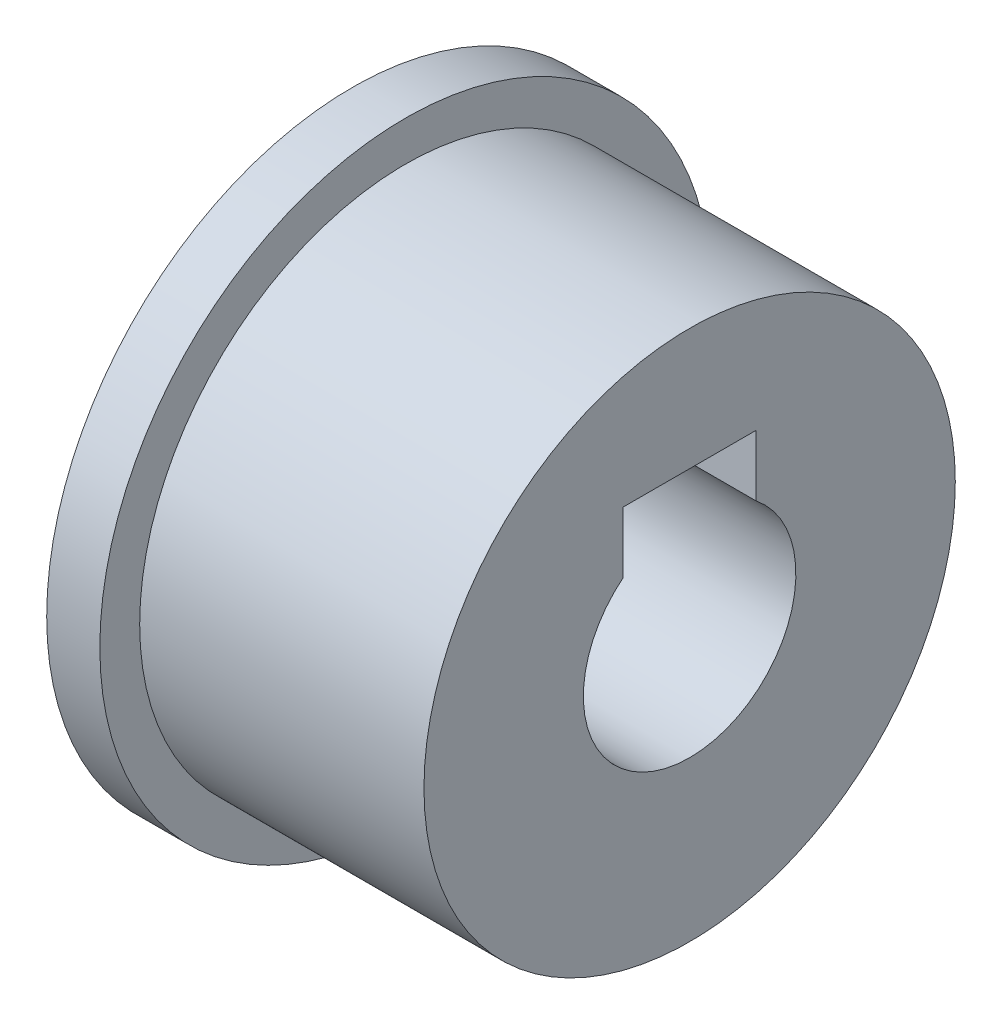
ISO-10303-21;
HEADER;
FILE_DESCRIPTION(('STEP AP214'),'2;1');
FILE_NAME('part.step','',(''),(''),'','','');
FILE_SCHEMA(('AUTOMOTIVE_DESIGN { 1 0 10303 214 1 1 1 1 }'));
ENDSEC;
DATA;
#1=APPLICATION_CONTEXT('core data for automotive mechanical design processes');
#2=APPLICATION_PROTOCOL_DEFINITION('international standard','automotive_design',2000,#1);
#3=PRODUCT_CONTEXT('',#1,'mechanical');
#4=PRODUCT('Part','Part','',(#3));
#5=PRODUCT_RELATED_PRODUCT_CATEGORY('part','',(#4));
#6=PRODUCT_DEFINITION_FORMATION('','',#4);
#7=PRODUCT_DEFINITION_CONTEXT('part definition',#1,'design');
#8=PRODUCT_DEFINITION('design','',#6,#7);
#9=PRODUCT_DEFINITION_SHAPE('','',#8);
#10=(LENGTH_UNIT() NAMED_UNIT(*) SI_UNIT(.MILLI.,.METRE.));
#11=(NAMED_UNIT(*) PLANE_ANGLE_UNIT() SI_UNIT($,.RADIAN.));
#12=(NAMED_UNIT(*) SI_UNIT($,.STERADIAN.) SOLID_ANGLE_UNIT());
#13=UNCERTAINTY_MEASURE_WITH_UNIT(LENGTH_MEASURE(1.E-05),#10,'distance_accuracy_value','');
#14=(GEOMETRIC_REPRESENTATION_CONTEXT(3) GLOBAL_UNCERTAINTY_ASSIGNED_CONTEXT((#13)) GLOBAL_UNIT_ASSIGNED_CONTEXT((#10,
#11,#12)) REPRESENTATION_CONTEXT('',''));
#15=CARTESIAN_POINT('',(0.,0.,0.));
#16=DIRECTION('',(0.,0.,1.));
#17=DIRECTION('',(1.,0.,0.));
#18=AXIS2_PLACEMENT_3D('',#15,#16,#17);
#19=CARTESIAN_POINT('',(12.7,0.,0.));
#20=DIRECTION('',(-1.,0.,0.));
#21=DIRECTION('',(0.,0.,1.));
#22=AXIS2_PLACEMENT_3D('',#19,#20,#21);
#23=CYLINDRICAL_SURFACE('',#22,10.);
#24=CARTESIAN_POINT('',(12.7,0.,0.));
#25=DIRECTION('',(1.,0.,0.));
#26=DIRECTION('',(0.,0.,-1.));
#27=AXIS2_PLACEMENT_3D('',#24,#25,#26);
#28=CIRCLE('',#27,10.);
#29=CARTESIAN_POINT('',(12.7,0.,-10.));
#30=VERTEX_POINT('',#29);
#31=EDGE_CURVE('E53',#30,#30,#28,.T.);
#32=ORIENTED_EDGE('',*,*,#31,.F.);
#33=EDGE_LOOP('',(#32));
#34=FACE_BOUND('',#33,.T.);
#35=CARTESIAN_POINT('',(2.,0.,0.));
#36=DIRECTION('',(-1.,0.,0.));
#37=DIRECTION('',(0.,0.,1.));
#38=AXIS2_PLACEMENT_3D('',#35,#36,#37);
#39=CIRCLE('',#38,10.);
#40=CARTESIAN_POINT('',(2.,0.,10.));
#41=VERTEX_POINT('',#40);
#42=EDGE_CURVE('E11',#41,#41,#39,.T.);
#43=ORIENTED_EDGE('',*,*,#42,.F.);
#44=EDGE_LOOP('',(#43));
#45=FACE_BOUND('',#44,.T.);
#46=ADVANCED_FACE('F45',(#34,#45),#23,.T.);
#47=CARTESIAN_POINT('',(12.7,0.,0.));
#48=DIRECTION('',(1.,0.,0.));
#49=DIRECTION('',(0.,0.,-1.));
#50=AXIS2_PLACEMENT_3D('',#47,#48,#49);
#51=PLANE('',#50);
#52=ORIENTED_EDGE('',*,*,#31,.T.);
#53=EDGE_LOOP('',(#52));
#54=FACE_BOUND('',#53,.T.);
#55=DIRECTION('',(0.,1.,0.));
#56=VECTOR('',#55,1.);
#57=CARTESIAN_POINT('',(12.7,5.4224989991992,-2.5));
#58=LINE('',#57,#56);
#59=CARTESIAN_POINT('',(12.7,3.1224989991992,-2.5));
#60=VERTEX_POINT('',#59);
#61=CARTESIAN_POINT('',(12.7,5.4224989991992,-2.5));
#62=VERTEX_POINT('',#61);
#63=EDGE_CURVE('E95',#60,#62,#58,.T.);
#64=ORIENTED_EDGE('',*,*,#63,.F.);
#65=CARTESIAN_POINT('',(12.7,0.,0.));
#66=DIRECTION('',(1.,0.,0.));
#67=DIRECTION('',(0.,0.,-1.));
#68=AXIS2_PLACEMENT_3D('',#65,#66,#67);
#69=CIRCLE('',#68,4.);
#70=CARTESIAN_POINT('',(12.7,3.1224989991992,2.5));
#71=VERTEX_POINT('',#70);
#72=EDGE_CURVE('E86',#71,#60,#69,.T.);
#73=ORIENTED_EDGE('',*,*,#72,.F.);
#74=DIRECTION('',(0.,-1.,0.));
#75=VECTOR('',#74,1.);
#76=CARTESIAN_POINT('',(12.7,5.4224989991992,2.5));
#77=LINE('',#76,#75);
#78=CARTESIAN_POINT('',(12.7,5.4224989991992,2.5));
#79=VERTEX_POINT('',#78);
#80=EDGE_CURVE('E112',#79,#71,#77,.T.);
#81=ORIENTED_EDGE('',*,*,#80,.F.);
#82=DIRECTION('',(0.,0.,1.));
#83=VECTOR('',#82,1.);
#84=CARTESIAN_POINT('',(12.7,5.4224989991992,2.5));
#85=LINE('',#84,#83);
#86=EDGE_CURVE('E108',#62,#79,#85,.T.);
#87=ORIENTED_EDGE('',*,*,#86,.F.);
#88=EDGE_LOOP('',(#64,#73,#81,#87));
#89=FACE_BOUND('',#88,.T.);
#90=ADVANCED_FACE('F107',(#54,#89),#51,.T.);
#91=CARTESIAN_POINT('',(0.,0.,0.));
#92=DIRECTION('',(1.,0.,0.));
#93=DIRECTION('',(0.,0.,-1.));
#94=AXIS2_PLACEMENT_3D('',#91,#92,#93);
#95=PLANE('',#94);
#96=CARTESIAN_POINT('',(0.,0.,0.));
#97=DIRECTION('',(1.,0.,0.));
#98=DIRECTION('',(0.,0.,-1.));
#99=AXIS2_PLACEMENT_3D('',#96,#97,#98);
#100=CIRCLE('',#99,4.);
#101=CARTESIAN_POINT('',(0.,3.1224989991992,2.5));
#102=VERTEX_POINT('',#101);
#103=CARTESIAN_POINT('',(0.,3.1224989991992,-2.5));
#104=VERTEX_POINT('',#103);
#105=EDGE_CURVE('E68',#102,#104,#100,.T.);
#106=ORIENTED_EDGE('',*,*,#105,.T.);
#107=DIRECTION('',(0.,1.,0.));
#108=VECTOR('',#107,1.);
#109=CARTESIAN_POINT('',(0.,5.4224989991992,-2.5));
#110=LINE('',#109,#108);
#111=CARTESIAN_POINT('',(0.,5.4224989991992,-2.5));
#112=VERTEX_POINT('',#111);
#113=EDGE_CURVE('E102',#104,#112,#110,.T.);
#114=ORIENTED_EDGE('',*,*,#113,.T.);
#115=DIRECTION('',(0.,0.,1.));
#116=VECTOR('',#115,1.);
#117=CARTESIAN_POINT('',(0.,5.4224989991992,2.5));
#118=LINE('',#117,#116);
#119=CARTESIAN_POINT('',(0.,5.4224989991992,2.5));
#120=VERTEX_POINT('',#119);
#121=EDGE_CURVE('E123',#112,#120,#118,.T.);
#122=ORIENTED_EDGE('',*,*,#121,.T.);
#123=DIRECTION('',(0.,-1.,0.));
#124=VECTOR('',#123,1.);
#125=CARTESIAN_POINT('',(0.,5.4224989991992,2.5));
#126=LINE('',#125,#124);
#127=EDGE_CURVE('E96',#120,#102,#126,.T.);
#128=ORIENTED_EDGE('',*,*,#127,.T.);
#129=EDGE_LOOP('',(#106,#114,#122,#128));
#130=FACE_BOUND('',#129,.T.);
#131=CARTESIAN_POINT('',(0.,0.,0.));
#132=DIRECTION('',(-1.,0.,0.));
#133=DIRECTION('',(0.,0.,1.));
#134=AXIS2_PLACEMENT_3D('',#131,#132,#133);
#135=CIRCLE('',#134,11.5);
#136=CARTESIAN_POINT('',(0.,0.,11.5));
#137=VERTEX_POINT('',#136);
#138=EDGE_CURVE('E153',#137,#137,#135,.T.);
#139=ORIENTED_EDGE('',*,*,#138,.T.);
#140=EDGE_LOOP('',(#139));
#141=FACE_BOUND('',#140,.T.);
#142=ADVANCED_FACE('F159',(#130,#141),#95,.F.);
#143=CARTESIAN_POINT('',(12.7,0.,0.));
#144=DIRECTION('',(-1.,0.,0.));
#145=DIRECTION('',(0.,0.,1.));
#146=AXIS2_PLACEMENT_3D('',#143,#144,#145);
#147=CYLINDRICAL_SURFACE('',#146,4.);
#148=ORIENTED_EDGE('',*,*,#105,.F.);
#149=DIRECTION('',(-1.,0.,0.));
#150=VECTOR('',#149,1.);
#151=CARTESIAN_POINT('',(12.7,3.1224989991992,2.5));
#152=LINE('',#151,#150);
#153=EDGE_CURVE('E90',#71,#102,#152,.T.);
#154=ORIENTED_EDGE('',*,*,#153,.F.);
#155=ORIENTED_EDGE('',*,*,#72,.T.);
#156=DIRECTION('',(-1.,0.,0.));
#157=VECTOR('',#156,1.);
#158=CARTESIAN_POINT('',(12.7,3.1224989991992,-2.5));
#159=LINE('',#158,#157);
#160=EDGE_CURVE('E89',#60,#104,#159,.T.);
#161=ORIENTED_EDGE('',*,*,#160,.T.);
#162=EDGE_LOOP('',(#148,#154,#155,#161));
#163=FACE_BOUND('',#162,.T.);
#164=ADVANCED_FACE('F88',(#163),#147,.F.);
#165=CARTESIAN_POINT('',(12.7,5.4224989991992,-2.5));
#166=DIRECTION('',(0.,0.,1.));
#167=DIRECTION('',(0.,-1.,0.));
#168=AXIS2_PLACEMENT_3D('',#165,#166,#167);
#169=PLANE('',#168);
#170=ORIENTED_EDGE('',*,*,#113,.F.);
#171=ORIENTED_EDGE('',*,*,#160,.F.);
#172=ORIENTED_EDGE('',*,*,#63,.T.);
#173=DIRECTION('',(-1.,0.,0.));
#174=VECTOR('',#173,1.);
#175=CARTESIAN_POINT('',(12.7,5.4224989991992,-2.5));
#176=LINE('',#175,#174);
#177=EDGE_CURVE('E104',#62,#112,#176,.T.);
#178=ORIENTED_EDGE('',*,*,#177,.T.);
#179=EDGE_LOOP('',(#170,#171,#172,#178));
#180=FACE_BOUND('',#179,.T.);
#181=ADVANCED_FACE('F99',(#180),#169,.T.);
#182=CARTESIAN_POINT('',(12.7,5.4224989991992,2.5));
#183=DIRECTION('',(0.,-1.,0.));
#184=DIRECTION('',(0.,0.,-1.));
#185=AXIS2_PLACEMENT_3D('',#182,#183,#184);
#186=PLANE('',#185);
#187=ORIENTED_EDGE('',*,*,#121,.F.);
#188=ORIENTED_EDGE('',*,*,#177,.F.);
#189=ORIENTED_EDGE('',*,*,#86,.T.);
#190=DIRECTION('',(-1.,0.,0.));
#191=VECTOR('',#190,1.);
#192=CARTESIAN_POINT('',(12.7,5.4224989991992,2.5));
#193=LINE('',#192,#191);
#194=EDGE_CURVE('E60',#79,#120,#193,.T.);
#195=ORIENTED_EDGE('',*,*,#194,.T.);
#196=EDGE_LOOP('',(#187,#188,#189,#195));
#197=FACE_BOUND('',#196,.T.);
#198=ADVANCED_FACE('F168',(#197),#186,.T.);
#199=CARTESIAN_POINT('',(12.7,5.4224989991992,2.5));
#200=DIRECTION('',(0.,0.,-1.));
#201=DIRECTION('',(0.,1.,0.));
#202=AXIS2_PLACEMENT_3D('',#199,#200,#201);
#203=PLANE('',#202);
#204=ORIENTED_EDGE('',*,*,#127,.F.);
#205=ORIENTED_EDGE('',*,*,#194,.F.);
#206=ORIENTED_EDGE('',*,*,#80,.T.);
#207=ORIENTED_EDGE('',*,*,#153,.T.);
#208=EDGE_LOOP('',(#204,#205,#206,#207));
#209=FACE_BOUND('',#208,.T.);
#210=ADVANCED_FACE('F162',(#209),#203,.T.);
#211=CARTESIAN_POINT('',(2.,0.,0.));
#212=DIRECTION('',(-1.,0.,0.));
#213=DIRECTION('',(0.,0.,1.));
#214=AXIS2_PLACEMENT_3D('',#211,#212,#213);
#215=CYLINDRICAL_SURFACE('',#214,11.5);
#216=CARTESIAN_POINT('',(2.,0.,0.));
#217=DIRECTION('',(-1.,0.,0.));
#218=DIRECTION('',(0.,0.,1.));
#219=AXIS2_PLACEMENT_3D('',#216,#217,#218);
#220=CIRCLE('',#219,11.5);
#221=CARTESIAN_POINT('',(2.,0.,11.5));
#222=VERTEX_POINT('',#221);
#223=EDGE_CURVE('E120',#222,#222,#220,.T.);
#224=ORIENTED_EDGE('',*,*,#223,.T.);
#225=EDGE_LOOP('',(#224));
#226=FACE_BOUND('',#225,.T.);
#227=ORIENTED_EDGE('',*,*,#138,.F.);
#228=EDGE_LOOP('',(#227));
#229=FACE_BOUND('',#228,.T.);
#230=ADVANCED_FACE('F147',(#226,#229),#215,.T.);
#231=CARTESIAN_POINT('',(2.,0.,0.));
#232=DIRECTION('',(-1.,0.,0.));
#233=DIRECTION('',(0.,0.,1.));
#234=AXIS2_PLACEMENT_3D('',#231,#232,#233);
#235=PLANE('',#234);
#236=ORIENTED_EDGE('',*,*,#42,.T.);
#237=EDGE_LOOP('',(#236));
#238=FACE_BOUND('',#237,.T.);
#239=ORIENTED_EDGE('',*,*,#223,.F.);
#240=EDGE_LOOP('',(#239));
#241=FACE_BOUND('',#240,.T.);
#242=ADVANCED_FACE('F144',(#238,#241),#235,.F.);
#243=CLOSED_SHELL('',(#46,#90,#142,#164,#181,#198,#210,#230,#242));
#244=MANIFOLD_SOLID_BREP('B2',#243);
#245=ADVANCED_BREP_SHAPE_REPRESENTATION('',(#18,#244),#14);
#246=SHAPE_DEFINITION_REPRESENTATION(#9,#245);
ENDSEC;
END-ISO-10303-21;
